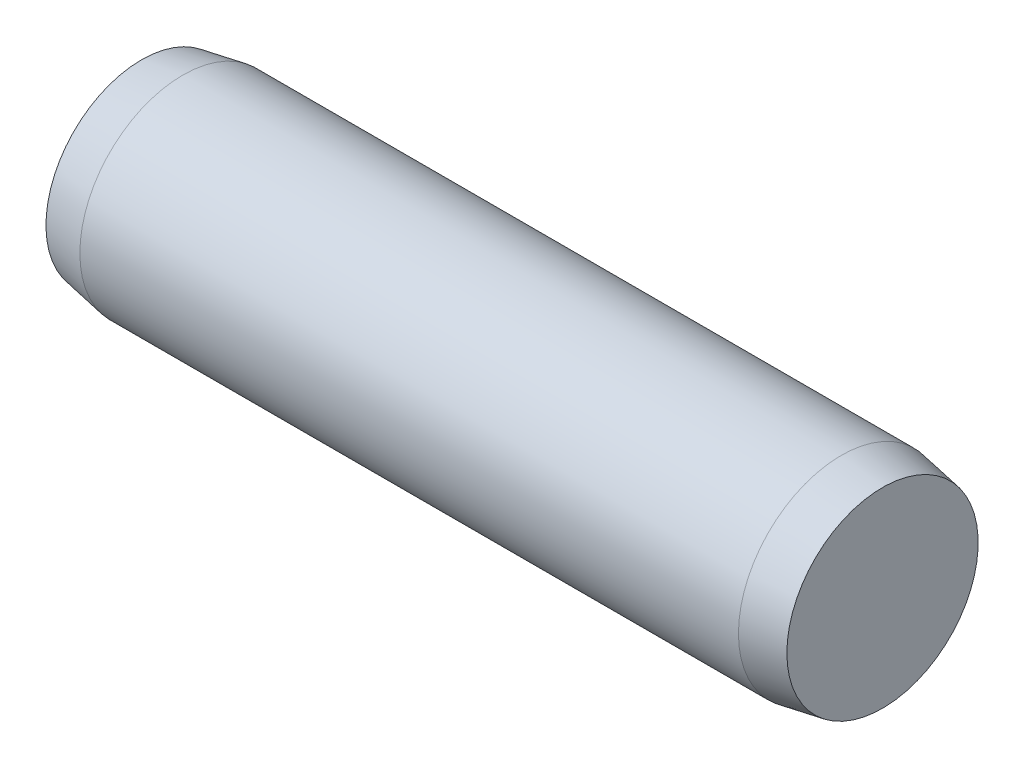
ISO-10303-21;
HEADER;
FILE_DESCRIPTION(('STEP AP214'),'2;1');
FILE_NAME('part.step','',(''),(''),'','','');
FILE_SCHEMA(('AUTOMOTIVE_DESIGN { 1 0 10303 214 1 1 1 1 }'));
ENDSEC;
DATA;
#1=APPLICATION_CONTEXT('core data for automotive mechanical design processes');
#2=APPLICATION_PROTOCOL_DEFINITION('international standard','automotive_design',2000,#1);
#3=PRODUCT_CONTEXT('',#1,'mechanical');
#4=PRODUCT('Part','Part','',(#3));
#5=PRODUCT_RELATED_PRODUCT_CATEGORY('part','',(#4));
#6=PRODUCT_DEFINITION_FORMATION('','',#4);
#7=PRODUCT_DEFINITION_CONTEXT('part definition',#1,'design');
#8=PRODUCT_DEFINITION('design','',#6,#7);
#9=PRODUCT_DEFINITION_SHAPE('','',#8);
#10=(LENGTH_UNIT() NAMED_UNIT(*) SI_UNIT(.MILLI.,.METRE.));
#11=(NAMED_UNIT(*) PLANE_ANGLE_UNIT() SI_UNIT($,.RADIAN.));
#12=(NAMED_UNIT(*) SI_UNIT($,.STERADIAN.) SOLID_ANGLE_UNIT());
#13=UNCERTAINTY_MEASURE_WITH_UNIT(LENGTH_MEASURE(1.E-05),#10,'distance_accuracy_value','');
#14=(GEOMETRIC_REPRESENTATION_CONTEXT(3) GLOBAL_UNCERTAINTY_ASSIGNED_CONTEXT((#13)) GLOBAL_UNIT_ASSIGNED_CONTEXT((#10,
#11,#12)) REPRESENTATION_CONTEXT('',''));
#15=CARTESIAN_POINT('',(0.,0.,0.));
#16=DIRECTION('',(0.,0.,1.));
#17=DIRECTION('',(1.,0.,0.));
#18=AXIS2_PLACEMENT_3D('',#15,#16,#17);
#19=CARTESIAN_POINT('',(0.,0.,0.));
#20=DIRECTION('',(-1.,0.,0.));
#21=DIRECTION('',(0.,0.,1.));
#22=AXIS2_PLACEMENT_3D('',#19,#20,#21);
#23=PLANE('',#22);
#24=CARTESIAN_POINT('',(0.,0.,0.));
#25=DIRECTION('',(-1.,0.,0.));
#26=DIRECTION('',(0.,0.,1.));
#27=AXIS2_PLACEMENT_3D('',#24,#25,#26);
#28=CIRCLE('',#27,1.85893841541976);
#29=CARTESIAN_POINT('',(0.,0.,1.85893841541976));
#30=VERTEX_POINT('',#29);
#31=EDGE_CURVE('E18',#30,#30,#28,.T.);
#32=ORIENTED_EDGE('',*,*,#31,.F.);
#33=EDGE_LOOP('',(#32));
#34=FACE_BOUND('',#33,.T.);
#35=ADVANCED_FACE('F15',(#34),#23,.F.);
#36=CARTESIAN_POINT('',(-14.4,0.,0.));
#37=DIRECTION('',(-1.,0.,0.));
#38=DIRECTION('',(0.,0.,1.));
#39=AXIS2_PLACEMENT_3D('',#36,#37,#38);
#40=PLANE('',#39);
#41=CARTESIAN_POINT('',(-14.4000000000233,0.,0.));
#42=DIRECTION('',(1.,0.,0.));
#43=DIRECTION('',(0.,1.,0.));
#44=AXIS2_PLACEMENT_3D('',#41,#42,#43);
#45=CIRCLE('',#44,1.85893841546239);
#46=CARTESIAN_POINT('',(-14.4000000000233,1.85893841546241,0.));
#47=VERTEX_POINT('',#46);
#48=EDGE_CURVE('E27',#47,#47,#45,.T.);
#49=ORIENTED_EDGE('',*,*,#48,.F.);
#50=EDGE_LOOP('',(#49));
#51=FACE_BOUND('',#50,.T.);
#52=ADVANCED_FACE('F39',(#51),#40,.T.);
#53=CARTESIAN_POINT('',(-0.800000000026557,0.,0.));
#54=DIRECTION('',(-1.,0.,0.));
#55=DIRECTION('',(0.,0.,1.));
#56=AXIS2_PLACEMENT_3D('',#53,#54,#55);
#57=CONICAL_SURFACE('',#56,1.99999999998113,0.174532925187202);
#58=ORIENTED_EDGE('',*,*,#31,.T.);
#59=EDGE_LOOP('',(#58));
#60=FACE_BOUND('',#59,.T.);
#61=CARTESIAN_POINT('',(-0.8,0.,0.));
#62=DIRECTION('',(-1.,0.,0.));
#63=DIRECTION('',(0.,0.,1.));
#64=AXIS2_PLACEMENT_3D('',#61,#62,#63);
#65=CIRCLE('',#64,2.);
#66=CARTESIAN_POINT('',(-0.8,0.,2.));
#67=VERTEX_POINT('',#66);
#68=EDGE_CURVE('E22',#67,#67,#65,.T.);
#69=ORIENTED_EDGE('',*,*,#68,.F.);
#70=EDGE_LOOP('',(#69));
#71=FACE_BOUND('',#70,.T.);
#72=ADVANCED_FACE('F35',(#60,#71),#57,.T.);
#73=CARTESIAN_POINT('',(-13.6000000000536,0.,0.));
#74=DIRECTION('',(1.,0.,0.));
#75=DIRECTION('',(0.,1.,0.));
#76=AXIS2_PLACEMENT_3D('',#73,#74,#75);
#77=CONICAL_SURFACE('',#76,2.00000000002376,0.174532925199353);
#78=CARTESIAN_POINT('',(-13.6,0.,0.));
#79=DIRECTION('',(-1.,0.,0.));
#80=DIRECTION('',(0.,0.,1.));
#81=AXIS2_PLACEMENT_3D('',#78,#79,#80);
#82=CIRCLE('',#81,2.);
#83=CARTESIAN_POINT('',(-13.6,0.,2.));
#84=VERTEX_POINT('',#83);
#85=EDGE_CURVE('E10',#84,#84,#82,.F.);
#86=ORIENTED_EDGE('',*,*,#85,.F.);
#87=EDGE_LOOP('',(#86));
#88=FACE_BOUND('',#87,.T.);
#89=ORIENTED_EDGE('',*,*,#48,.T.);
#90=EDGE_LOOP('',(#89));
#91=FACE_BOUND('',#90,.T.);
#92=ADVANCED_FACE('F47',(#88,#91),#77,.T.);
#93=CARTESIAN_POINT('',(0.72,0.,0.));
#94=DIRECTION('',(-1.,0.,0.));
#95=DIRECTION('',(0.,0.,1.));
#96=AXIS2_PLACEMENT_3D('',#93,#94,#95);
#97=CYLINDRICAL_SURFACE('',#96,2.);
#98=ORIENTED_EDGE('',*,*,#68,.T.);
#99=EDGE_LOOP('',(#98));
#100=FACE_BOUND('',#99,.T.);
#101=ORIENTED_EDGE('',*,*,#85,.T.);
#102=EDGE_LOOP('',(#101));
#103=FACE_BOUND('',#102,.T.);
#104=ADVANCED_FACE('F45',(#100,#103),#97,.T.);
#105=CLOSED_SHELL('',(#35,#52,#72,#92,#104));
#106=MANIFOLD_SOLID_BREP('B1',#105);
#107=ADVANCED_BREP_SHAPE_REPRESENTATION('',(#18,#106),#14);
#108=SHAPE_DEFINITION_REPRESENTATION(#9,#107);
ENDSEC;
END-ISO-10303-21;
